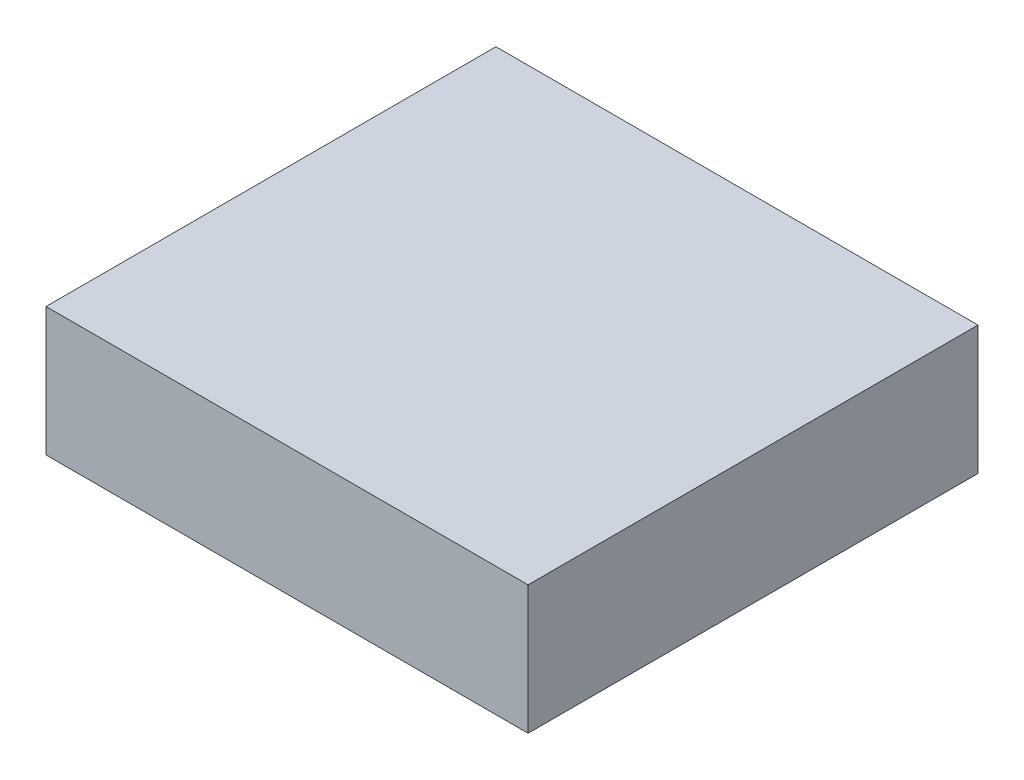
ISO-10303-21;
HEADER;
FILE_DESCRIPTION(('STEP AP214'),'2;1');
FILE_NAME('part.step','',(''),(''),'','','');
FILE_SCHEMA(('AUTOMOTIVE_DESIGN { 1 0 10303 214 1 1 1 1 }'));
ENDSEC;
DATA;
#1=APPLICATION_CONTEXT('core data for automotive mechanical design processes');
#2=APPLICATION_PROTOCOL_DEFINITION('international standard','automotive_design',2000,#1);
#3=PRODUCT_CONTEXT('',#1,'mechanical');
#4=PRODUCT('Part','Part','',(#3));
#5=PRODUCT_RELATED_PRODUCT_CATEGORY('part','',(#4));
#6=PRODUCT_DEFINITION_FORMATION('','',#4);
#7=PRODUCT_DEFINITION_CONTEXT('part definition',#1,'design');
#8=PRODUCT_DEFINITION('design','',#6,#7);
#9=PRODUCT_DEFINITION_SHAPE('','',#8);
#10=(LENGTH_UNIT() NAMED_UNIT(*) SI_UNIT(.MILLI.,.METRE.));
#11=(NAMED_UNIT(*) PLANE_ANGLE_UNIT() SI_UNIT($,.RADIAN.));
#12=(NAMED_UNIT(*) SI_UNIT($,.STERADIAN.) SOLID_ANGLE_UNIT());
#13=UNCERTAINTY_MEASURE_WITH_UNIT(LENGTH_MEASURE(1.E-05),#10,'distance_accuracy_value','');
#14=(GEOMETRIC_REPRESENTATION_CONTEXT(3) GLOBAL_UNCERTAINTY_ASSIGNED_CONTEXT((#13)) GLOBAL_UNIT_ASSIGNED_CONTEXT((#10,
#11,#12)) REPRESENTATION_CONTEXT('',''));
#15=CARTESIAN_POINT('',(0.,0.,0.));
#16=DIRECTION('',(0.,0.,1.));
#17=DIRECTION('',(1.,0.,0.));
#18=AXIS2_PLACEMENT_3D('',#15,#16,#17);
#19=CARTESIAN_POINT('',(-21.7948717948718,12.,-16.4102564102564));
#20=DIRECTION('',(1.,0.,0.));
#21=DIRECTION('',(0.,0.,-1.));
#22=AXIS2_PLACEMENT_3D('',#19,#20,#21);
#23=PLANE('',#22);
#24=DIRECTION('',(0.,0.,1.));
#25=VECTOR('',#24,1.);
#26=CARTESIAN_POINT('',(-21.7948717948718,0.,-16.4102564102564));
#27=LINE('',#26,#25);
#28=CARTESIAN_POINT('',(-21.7948717948718,0.,-16.4102564102564));
#29=VERTEX_POINT('',#28);
#30=CARTESIAN_POINT('',(-21.7948717948718,0.,25.5897435897436));
#31=VERTEX_POINT('',#30);
#32=EDGE_CURVE('E96',#29,#31,#27,.T.);
#33=ORIENTED_EDGE('',*,*,#32,.T.);
#34=DIRECTION('',(0.,-1.,0.));
#35=VECTOR('',#34,1.);
#36=CARTESIAN_POINT('',(-21.7948717948718,12.,25.5897435897436));
#37=LINE('',#36,#35);
#38=CARTESIAN_POINT('',(-21.7948717948718,12.,25.5897435897436));
#39=VERTEX_POINT('',#38);
#40=EDGE_CURVE('E11',#39,#31,#37,.T.);
#41=ORIENTED_EDGE('',*,*,#40,.F.);
#42=DIRECTION('',(0.,0.,1.));
#43=VECTOR('',#42,1.);
#44=CARTESIAN_POINT('',(-21.7948717948718,12.,-16.4102564102564));
#45=LINE('',#44,#43);
#46=CARTESIAN_POINT('',(-21.7948717948718,12.,-16.4102564102564));
#47=VERTEX_POINT('',#46);
#48=EDGE_CURVE('E84',#47,#39,#45,.T.);
#49=ORIENTED_EDGE('',*,*,#48,.F.);
#50=DIRECTION('',(0.,-1.,0.));
#51=VECTOR('',#50,1.);
#52=CARTESIAN_POINT('',(-21.7948717948718,12.,-16.4102564102564));
#53=LINE('',#52,#51);
#54=EDGE_CURVE('E92',#47,#29,#53,.T.);
#55=ORIENTED_EDGE('',*,*,#54,.T.);
#56=EDGE_LOOP('',(#33,#41,#49,#55));
#57=FACE_BOUND('',#56,.T.);
#58=ADVANCED_FACE('F33',(#57),#23,.F.);
#59=CARTESIAN_POINT('',(-21.7948717948718,12.,25.5897435897436));
#60=DIRECTION('',(0.,0.,-1.));
#61=DIRECTION('',(-1.,0.,0.));
#62=AXIS2_PLACEMENT_3D('',#59,#60,#61);
#63=PLANE('',#62);
#64=DIRECTION('',(1.,0.,0.));
#65=VECTOR('',#64,1.);
#66=CARTESIAN_POINT('',(-21.7948717948718,0.,25.5897435897436));
#67=LINE('',#66,#65);
#68=CARTESIAN_POINT('',(23.2051282051282,0.,25.5897435897436));
#69=VERTEX_POINT('',#68);
#70=EDGE_CURVE('E88',#31,#69,#67,.T.);
#71=ORIENTED_EDGE('',*,*,#70,.T.);
#72=DIRECTION('',(0.,-1.,0.));
#73=VECTOR('',#72,1.);
#74=CARTESIAN_POINT('',(23.2051282051282,12.,25.5897435897436));
#75=LINE('',#74,#73);
#76=CARTESIAN_POINT('',(23.2051282051282,12.,25.5897435897436));
#77=VERTEX_POINT('',#76);
#78=EDGE_CURVE('E41',#77,#69,#75,.T.);
#79=ORIENTED_EDGE('',*,*,#78,.F.);
#80=DIRECTION('',(1.,0.,0.));
#81=VECTOR('',#80,1.);
#82=CARTESIAN_POINT('',(-21.7948717948718,12.,25.5897435897436));
#83=LINE('',#82,#81);
#84=EDGE_CURVE('E79',#39,#77,#83,.T.);
#85=ORIENTED_EDGE('',*,*,#84,.F.);
#86=ORIENTED_EDGE('',*,*,#40,.T.);
#87=EDGE_LOOP('',(#71,#79,#85,#86));
#88=FACE_BOUND('',#87,.T.);
#89=ADVANCED_FACE('F87',(#88),#63,.F.);
#90=CARTESIAN_POINT('',(23.2051282051282,12.,-16.4102564102564));
#91=DIRECTION('',(-1.,0.,0.));
#92=DIRECTION('',(0.,0.,1.));
#93=AXIS2_PLACEMENT_3D('',#90,#91,#92);
#94=PLANE('',#93);
#95=DIRECTION('',(0.,0.,-1.));
#96=VECTOR('',#95,1.);
#97=CARTESIAN_POINT('',(23.2051282051282,0.,-16.4102564102564));
#98=LINE('',#97,#96);
#99=CARTESIAN_POINT('',(23.2051282051282,0.,-16.4102564102564));
#100=VERTEX_POINT('',#99);
#101=EDGE_CURVE('E66',#69,#100,#98,.T.);
#102=ORIENTED_EDGE('',*,*,#101,.T.);
#103=DIRECTION('',(0.,-1.,0.));
#104=VECTOR('',#103,1.);
#105=CARTESIAN_POINT('',(23.2051282051282,12.,-16.4102564102564));
#106=LINE('',#105,#104);
#107=CARTESIAN_POINT('',(23.2051282051282,12.,-16.4102564102564));
#108=VERTEX_POINT('',#107);
#109=EDGE_CURVE('E89',#108,#100,#106,.T.);
#110=ORIENTED_EDGE('',*,*,#109,.F.);
#111=DIRECTION('',(0.,0.,-1.));
#112=VECTOR('',#111,1.);
#113=CARTESIAN_POINT('',(23.2051282051282,12.,-16.4102564102564));
#114=LINE('',#113,#112);
#115=EDGE_CURVE('E82',#77,#108,#114,.T.);
#116=ORIENTED_EDGE('',*,*,#115,.F.);
#117=ORIENTED_EDGE('',*,*,#78,.T.);
#118=EDGE_LOOP('',(#102,#110,#116,#117));
#119=FACE_BOUND('',#118,.T.);
#120=ADVANCED_FACE('F90',(#119),#94,.F.);
#121=CARTESIAN_POINT('',(-21.7948717948718,12.,-16.4102564102564));
#122=DIRECTION('',(0.,0.,1.));
#123=DIRECTION('',(1.,0.,0.));
#124=AXIS2_PLACEMENT_3D('',#121,#122,#123);
#125=PLANE('',#124);
#126=DIRECTION('',(-1.,0.,0.));
#127=VECTOR('',#126,1.);
#128=CARTESIAN_POINT('',(-21.7948717948718,0.,-16.4102564102564));
#129=LINE('',#128,#127);
#130=EDGE_CURVE('E72',#100,#29,#129,.T.);
#131=ORIENTED_EDGE('',*,*,#130,.T.);
#132=ORIENTED_EDGE('',*,*,#54,.F.);
#133=DIRECTION('',(-1.,0.,0.));
#134=VECTOR('',#133,1.);
#135=CARTESIAN_POINT('',(-21.7948717948718,12.,-16.4102564102564));
#136=LINE('',#135,#134);
#137=EDGE_CURVE('E49',#108,#47,#136,.T.);
#138=ORIENTED_EDGE('',*,*,#137,.F.);
#139=ORIENTED_EDGE('',*,*,#109,.T.);
#140=EDGE_LOOP('',(#131,#132,#138,#139));
#141=FACE_BOUND('',#140,.T.);
#142=ADVANCED_FACE('F103',(#141),#125,.F.);
#143=CARTESIAN_POINT('',(0.,12.,0.));
#144=DIRECTION('',(0.,1.,0.));
#145=DIRECTION('',(0.,0.,1.));
#146=AXIS2_PLACEMENT_3D('',#143,#144,#145);
#147=PLANE('',#146);
#148=ORIENTED_EDGE('',*,*,#48,.T.);
#149=ORIENTED_EDGE('',*,*,#84,.T.);
#150=ORIENTED_EDGE('',*,*,#115,.T.);
#151=ORIENTED_EDGE('',*,*,#137,.T.);
#152=EDGE_LOOP('',(#148,#149,#150,#151));
#153=FACE_BOUND('',#152,.T.);
#154=ADVANCED_FACE('F80',(#153),#147,.T.);
#155=CARTESIAN_POINT('',(0.,0.,0.));
#156=DIRECTION('',(0.,1.,0.));
#157=DIRECTION('',(0.,0.,1.));
#158=AXIS2_PLACEMENT_3D('',#155,#156,#157);
#159=PLANE('',#158);
#160=ORIENTED_EDGE('',*,*,#32,.F.);
#161=ORIENTED_EDGE('',*,*,#130,.F.);
#162=ORIENTED_EDGE('',*,*,#101,.F.);
#163=ORIENTED_EDGE('',*,*,#70,.F.);
#164=EDGE_LOOP('',(#160,#161,#162,#163));
#165=FACE_BOUND('',#164,.T.);
#166=ADVANCED_FACE('F106',(#165),#159,.F.);
#167=CLOSED_SHELL('',(#58,#89,#120,#142,#154,#166));
#168=MANIFOLD_SOLID_BREP('B2',#167);
#169=ADVANCED_BREP_SHAPE_REPRESENTATION('',(#18,#168),#14);
#170=SHAPE_DEFINITION_REPRESENTATION(#9,#169);
ENDSEC;
END-ISO-10303-21;
